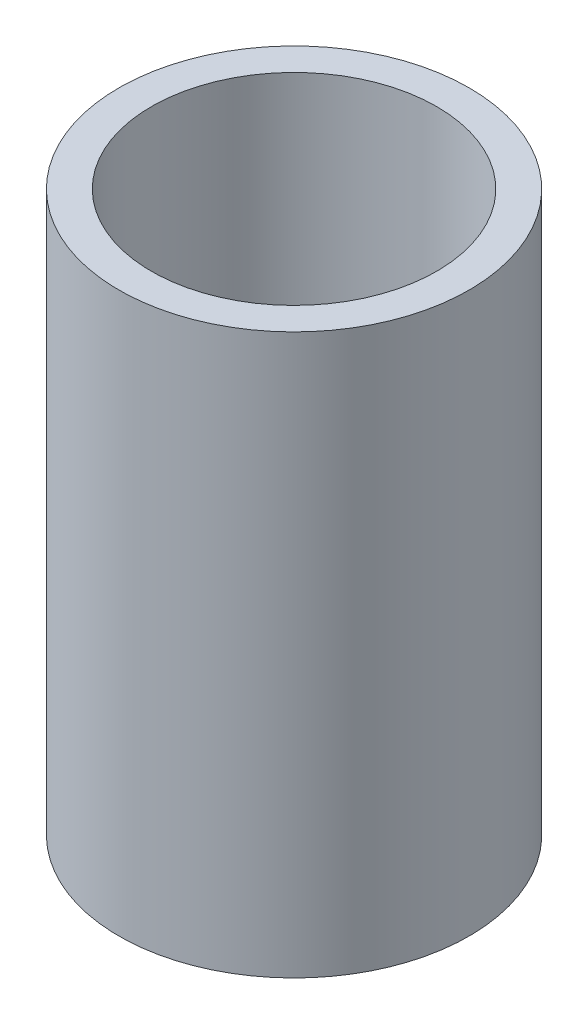
ISO-10303-21;
HEADER;
FILE_DESCRIPTION(('STEP AP214'),'2;1');
FILE_NAME('part.step','',(''),(''),'','','');
FILE_SCHEMA(('AUTOMOTIVE_DESIGN { 1 0 10303 214 1 1 1 1 }'));
ENDSEC;
DATA;
#1=APPLICATION_CONTEXT('core data for automotive mechanical design processes');
#2=APPLICATION_PROTOCOL_DEFINITION('international standard','automotive_design',2000,#1);
#3=PRODUCT_CONTEXT('',#1,'mechanical');
#4=PRODUCT('Part','Part','',(#3));
#5=PRODUCT_RELATED_PRODUCT_CATEGORY('part','',(#4));
#6=PRODUCT_DEFINITION_FORMATION('','',#4);
#7=PRODUCT_DEFINITION_CONTEXT('part definition',#1,'design');
#8=PRODUCT_DEFINITION('design','',#6,#7);
#9=PRODUCT_DEFINITION_SHAPE('','',#8);
#10=(LENGTH_UNIT() NAMED_UNIT(*) SI_UNIT(.MILLI.,.METRE.));
#11=(NAMED_UNIT(*) PLANE_ANGLE_UNIT() SI_UNIT($,.RADIAN.));
#12=(NAMED_UNIT(*) SI_UNIT($,.STERADIAN.) SOLID_ANGLE_UNIT());
#13=UNCERTAINTY_MEASURE_WITH_UNIT(LENGTH_MEASURE(1.E-05),#10,'distance_accuracy_value','');
#14=(GEOMETRIC_REPRESENTATION_CONTEXT(3) GLOBAL_UNCERTAINTY_ASSIGNED_CONTEXT((#13)) GLOBAL_UNIT_ASSIGNED_CONTEXT((#10,
#11,#12)) REPRESENTATION_CONTEXT('',''));
#15=CARTESIAN_POINT('',(0.,0.,0.));
#16=DIRECTION('',(0.,0.,1.));
#17=DIRECTION('',(1.,0.,0.));
#18=AXIS2_PLACEMENT_3D('',#15,#16,#17);
#19=CARTESIAN_POINT('',(0.,-12.7,0.));
#20=DIRECTION('',(0.,-1.,0.));
#21=DIRECTION('',(0.,0.,-1.));
#22=AXIS2_PLACEMENT_3D('',#19,#20,#21);
#23=CYLINDRICAL_SURFACE('',#22,3.2385);
#24=CARTESIAN_POINT('',(0.,0.,0.));
#25=DIRECTION('',(0.,-1.,0.));
#26=DIRECTION('',(0.,0.,-1.));
#27=AXIS2_PLACEMENT_3D('',#24,#25,#26);
#28=CIRCLE('',#27,3.2385);
#29=CARTESIAN_POINT('',(0.,0.,-3.2385));
#30=VERTEX_POINT('',#29);
#31=EDGE_CURVE('E26',#30,#30,#28,.T.);
#32=ORIENTED_EDGE('',*,*,#31,.F.);
#33=EDGE_LOOP('',(#32));
#34=FACE_BOUND('',#33,.T.);
#35=CARTESIAN_POINT('',(0.,-12.7,0.));
#36=DIRECTION('',(0.,-1.,0.));
#37=DIRECTION('',(0.,0.,-1.));
#38=AXIS2_PLACEMENT_3D('',#35,#36,#37);
#39=CIRCLE('',#38,3.2385);
#40=CARTESIAN_POINT('',(0.,-12.7,-3.2385));
#41=VERTEX_POINT('',#40);
#42=EDGE_CURVE('E17',#41,#41,#39,.T.);
#43=ORIENTED_EDGE('',*,*,#42,.T.);
#44=EDGE_LOOP('',(#43));
#45=FACE_BOUND('',#44,.T.);
#46=ADVANCED_FACE('F14',(#34,#45),#23,.F.);
#47=CARTESIAN_POINT('',(0.,-12.7,0.));
#48=DIRECTION('',(0.,1.,0.));
#49=DIRECTION('',(0.,0.,1.));
#50=AXIS2_PLACEMENT_3D('',#47,#48,#49);
#51=PLANE('',#50);
#52=CARTESIAN_POINT('',(0.,-12.7,0.));
#53=DIRECTION('',(0.,-1.,0.));
#54=DIRECTION('',(0.,0.,-1.));
#55=AXIS2_PLACEMENT_3D('',#52,#53,#54);
#56=CIRCLE('',#55,3.9751);
#57=CARTESIAN_POINT('',(0.,-12.7,-3.9751));
#58=VERTEX_POINT('',#57);
#59=EDGE_CURVE('E21',#58,#58,#56,.F.);
#60=ORIENTED_EDGE('',*,*,#59,.F.);
#61=EDGE_LOOP('',(#60));
#62=FACE_BOUND('',#61,.T.);
#63=ORIENTED_EDGE('',*,*,#42,.F.);
#64=EDGE_LOOP('',(#63));
#65=FACE_BOUND('',#64,.T.);
#66=ADVANCED_FACE('F35',(#62,#65),#51,.F.);
#67=CARTESIAN_POINT('',(0.,0.,0.));
#68=DIRECTION('',(0.,1.,0.));
#69=DIRECTION('',(0.,0.,1.));
#70=AXIS2_PLACEMENT_3D('',#67,#68,#69);
#71=PLANE('',#70);
#72=CARTESIAN_POINT('',(0.,0.,0.));
#73=DIRECTION('',(0.,-1.,0.));
#74=DIRECTION('',(0.,0.,-1.));
#75=AXIS2_PLACEMENT_3D('',#72,#73,#74);
#76=CIRCLE('',#75,3.9751);
#77=CARTESIAN_POINT('',(0.,0.,-3.9751));
#78=VERTEX_POINT('',#77);
#79=EDGE_CURVE('E10',#78,#78,#76,.T.);
#80=ORIENTED_EDGE('',*,*,#79,.F.);
#81=EDGE_LOOP('',(#80));
#82=FACE_BOUND('',#81,.T.);
#83=ORIENTED_EDGE('',*,*,#31,.T.);
#84=EDGE_LOOP('',(#83));
#85=FACE_BOUND('',#84,.T.);
#86=ADVANCED_FACE('F37',(#82,#85),#71,.T.);
#87=CARTESIAN_POINT('',(0.,-12.7,0.));
#88=DIRECTION('',(0.,-1.,0.));
#89=DIRECTION('',(0.,0.,-1.));
#90=AXIS2_PLACEMENT_3D('',#87,#88,#89);
#91=CYLINDRICAL_SURFACE('',#90,3.9751);
#92=ORIENTED_EDGE('',*,*,#79,.T.);
#93=EDGE_LOOP('',(#92));
#94=FACE_BOUND('',#93,.T.);
#95=ORIENTED_EDGE('',*,*,#59,.T.);
#96=EDGE_LOOP('',(#95));
#97=FACE_BOUND('',#96,.T.);
#98=ADVANCED_FACE('F44',(#94,#97),#91,.T.);
#99=CLOSED_SHELL('',(#46,#66,#86,#98));
#100=MANIFOLD_SOLID_BREP('B1',#99);
#101=ADVANCED_BREP_SHAPE_REPRESENTATION('',(#18,#100),#14);
#102=SHAPE_DEFINITION_REPRESENTATION(#9,#101);
ENDSEC;
END-ISO-10303-21;
